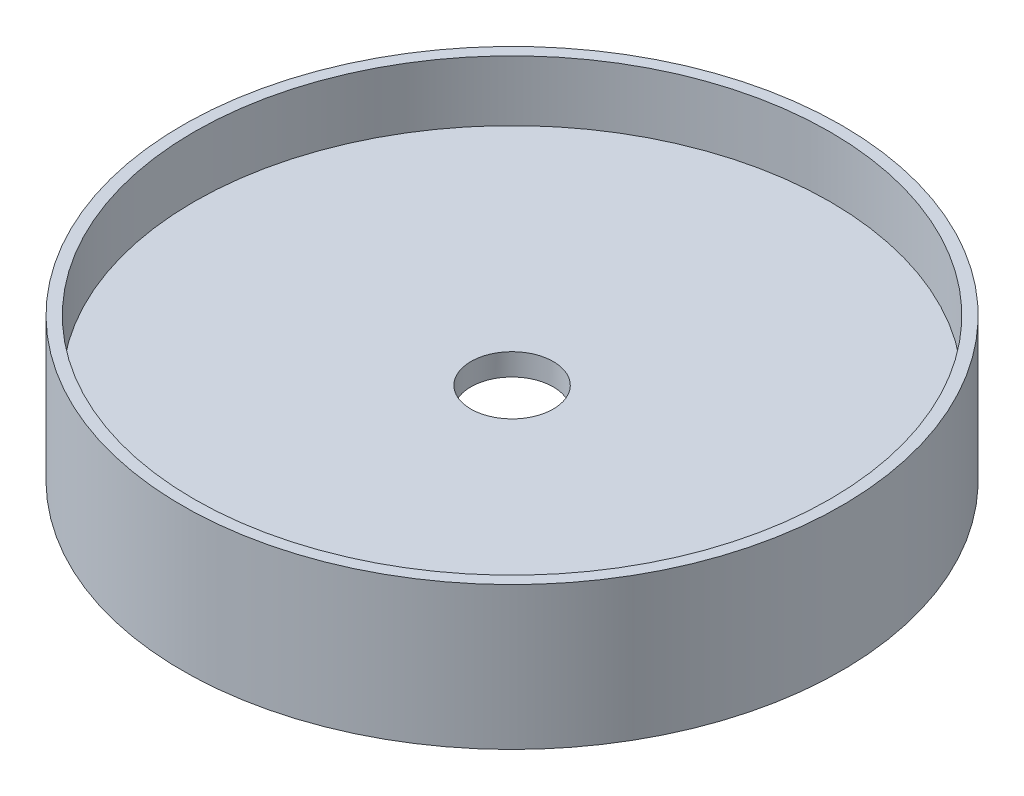
ISO-10303-21;
HEADER;
FILE_DESCRIPTION(('STEP AP214'),'2;1');
FILE_NAME('part.step','',(''),(''),'','','');
FILE_SCHEMA(('AUTOMOTIVE_DESIGN { 1 0 10303 214 1 1 1 1 }'));
ENDSEC;
DATA;
#1=APPLICATION_CONTEXT('core data for automotive mechanical design processes');
#2=APPLICATION_PROTOCOL_DEFINITION('international standard','automotive_design',2000,#1);
#3=PRODUCT_CONTEXT('',#1,'mechanical');
#4=PRODUCT('Part','Part','',(#3));
#5=PRODUCT_RELATED_PRODUCT_CATEGORY('part','',(#4));
#6=PRODUCT_DEFINITION_FORMATION('','',#4);
#7=PRODUCT_DEFINITION_CONTEXT('part definition',#1,'design');
#8=PRODUCT_DEFINITION('design','',#6,#7);
#9=PRODUCT_DEFINITION_SHAPE('','',#8);
#10=(LENGTH_UNIT() NAMED_UNIT(*) SI_UNIT(.MILLI.,.METRE.));
#11=(NAMED_UNIT(*) PLANE_ANGLE_UNIT() SI_UNIT($,.RADIAN.));
#12=(NAMED_UNIT(*) SI_UNIT($,.STERADIAN.) SOLID_ANGLE_UNIT());
#13=UNCERTAINTY_MEASURE_WITH_UNIT(LENGTH_MEASURE(1.E-05),#10,'distance_accuracy_value','');
#14=(GEOMETRIC_REPRESENTATION_CONTEXT(3) GLOBAL_UNCERTAINTY_ASSIGNED_CONTEXT((#13)) GLOBAL_UNIT_ASSIGNED_CONTEXT((#10,
#11,#12)) REPRESENTATION_CONTEXT('',''));
#15=CARTESIAN_POINT('',(0.,0.,0.));
#16=DIRECTION('',(0.,0.,1.));
#17=DIRECTION('',(1.,0.,0.));
#18=AXIS2_PLACEMENT_3D('',#15,#16,#17);
#19=CARTESIAN_POINT('',(0.,20.,0.));
#20=DIRECTION('',(0.,-1.,0.));
#21=DIRECTION('',(0.,0.,-1.));
#22=AXIS2_PLACEMENT_3D('',#19,#20,#21);
#23=PLANE('',#22);
#24=CARTESIAN_POINT('',(0.,20.,0.));
#25=DIRECTION('',(0.,1.,0.));
#26=DIRECTION('',(0.,0.,1.));
#27=AXIS2_PLACEMENT_3D('',#24,#25,#26);
#28=CIRCLE('',#27,37.5);
#29=CARTESIAN_POINT('',(0.,20.,37.5));
#30=VERTEX_POINT('',#29);
#31=EDGE_CURVE('E56',#30,#30,#28,.T.);
#32=ORIENTED_EDGE('',*,*,#31,.F.);
#33=EDGE_LOOP('',(#32));
#34=FACE_BOUND('',#33,.T.);
#35=CARTESIAN_POINT('',(0.,20.,0.));
#36=DIRECTION('',(0.,-1.,0.));
#37=DIRECTION('',(0.,0.,-1.));
#38=AXIS2_PLACEMENT_3D('',#35,#36,#37);
#39=CIRCLE('',#38,289.5);
#40=CARTESIAN_POINT('',(0.,20.,-289.5));
#41=VERTEX_POINT('',#40);
#42=EDGE_CURVE('E10',#41,#41,#39,.T.);
#43=ORIENTED_EDGE('',*,*,#42,.F.);
#44=EDGE_LOOP('',(#43));
#45=FACE_BOUND('',#44,.T.);
#46=ADVANCED_FACE('F31',(#34,#45),#23,.F.);
#47=CARTESIAN_POINT('',(0.,0.,0.));
#48=DIRECTION('',(0.,-1.,0.));
#49=DIRECTION('',(0.,0.,-1.));
#50=AXIS2_PLACEMENT_3D('',#47,#48,#49);
#51=CYLINDRICAL_SURFACE('',#50,289.5);
#52=CARTESIAN_POINT('',(0.,75.,0.));
#53=DIRECTION('',(0.,-1.,0.));
#54=DIRECTION('',(0.,0.,-1.));
#55=AXIS2_PLACEMENT_3D('',#52,#53,#54);
#56=CIRCLE('',#55,289.5);
#57=CARTESIAN_POINT('',(0.,75.,-289.5));
#58=VERTEX_POINT('',#57);
#59=EDGE_CURVE('E38',#58,#58,#56,.T.);
#60=ORIENTED_EDGE('',*,*,#59,.F.);
#61=EDGE_LOOP('',(#60));
#62=FACE_BOUND('',#61,.T.);
#63=ORIENTED_EDGE('',*,*,#42,.T.);
#64=EDGE_LOOP('',(#63));
#65=FACE_BOUND('',#64,.T.);
#66=ADVANCED_FACE('F89',(#62,#65),#51,.F.);
#67=CARTESIAN_POINT('',(289.5,75.,0.));
#68=DIRECTION('',(0.,-1.,0.));
#69=DIRECTION('',(0.,0.,-1.));
#70=AXIS2_PLACEMENT_3D('',#67,#68,#69);
#71=PLANE('',#70);
#72=CARTESIAN_POINT('',(0.,75.,0.));
#73=DIRECTION('',(0.,-1.,0.));
#74=DIRECTION('',(0.,0.,-1.));
#75=AXIS2_PLACEMENT_3D('',#72,#73,#74);
#76=CIRCLE('',#75,300.);
#77=CARTESIAN_POINT('',(0.,75.,-300.));
#78=VERTEX_POINT('',#77);
#79=EDGE_CURVE('E42',#78,#78,#76,.T.);
#80=ORIENTED_EDGE('',*,*,#79,.F.);
#81=EDGE_LOOP('',(#80));
#82=FACE_BOUND('',#81,.T.);
#83=ORIENTED_EDGE('',*,*,#59,.T.);
#84=EDGE_LOOP('',(#83));
#85=FACE_BOUND('',#84,.T.);
#86=ADVANCED_FACE('F85',(#82,#85),#71,.F.);
#87=CARTESIAN_POINT('',(0.,0.,0.));
#88=DIRECTION('',(0.,-1.,0.));
#89=DIRECTION('',(0.,0.,-1.));
#90=AXIS2_PLACEMENT_3D('',#87,#88,#89);
#91=CYLINDRICAL_SURFACE('',#90,300.);
#92=ORIENTED_EDGE('',*,*,#79,.T.);
#93=EDGE_LOOP('',(#92));
#94=FACE_BOUND('',#93,.T.);
#95=CARTESIAN_POINT('',(0.,-55.,0.));
#96=DIRECTION('',(0.,-1.,0.));
#97=DIRECTION('',(0.,0.,-1.));
#98=AXIS2_PLACEMENT_3D('',#95,#96,#97);
#99=CIRCLE('',#98,300.);
#100=CARTESIAN_POINT('',(0.,-55.,-300.));
#101=VERTEX_POINT('',#100);
#102=EDGE_CURVE('E47',#101,#101,#99,.T.);
#103=ORIENTED_EDGE('',*,*,#102,.F.);
#104=EDGE_LOOP('',(#103));
#105=FACE_BOUND('',#104,.T.);
#106=ADVANCED_FACE('F79',(#94,#105),#91,.T.);
#107=CARTESIAN_POINT('',(289.5,-55.,0.));
#108=DIRECTION('',(0.,-1.,0.));
#109=DIRECTION('',(0.,0.,-1.));
#110=AXIS2_PLACEMENT_3D('',#107,#108,#109);
#111=PLANE('',#110);
#112=ORIENTED_EDGE('',*,*,#102,.T.);
#113=EDGE_LOOP('',(#112));
#114=FACE_BOUND('',#113,.T.);
#115=CARTESIAN_POINT('',(0.,-55.,0.));
#116=DIRECTION('',(0.,-1.,0.));
#117=DIRECTION('',(0.,0.,-1.));
#118=AXIS2_PLACEMENT_3D('',#115,#116,#117);
#119=CIRCLE('',#118,289.5);
#120=CARTESIAN_POINT('',(0.,-55.,-289.5));
#121=VERTEX_POINT('',#120);
#122=EDGE_CURVE('E50',#121,#121,#119,.T.);
#123=ORIENTED_EDGE('',*,*,#122,.F.);
#124=EDGE_LOOP('',(#123));
#125=FACE_BOUND('',#124,.T.);
#126=ADVANCED_FACE('F74',(#114,#125),#111,.T.);
#127=CARTESIAN_POINT('',(0.,0.,0.));
#128=DIRECTION('',(0.,-1.,0.));
#129=DIRECTION('',(0.,0.,-1.));
#130=AXIS2_PLACEMENT_3D('',#127,#128,#129);
#131=CYLINDRICAL_SURFACE('',#130,289.5);
#132=CARTESIAN_POINT('',(0.,0.,0.));
#133=DIRECTION('',(0.,-1.,0.));
#134=DIRECTION('',(0.,0.,-1.));
#135=AXIS2_PLACEMENT_3D('',#132,#133,#134);
#136=CIRCLE('',#135,289.5);
#137=CARTESIAN_POINT('',(0.,0.,-289.5));
#138=VERTEX_POINT('',#137);
#139=EDGE_CURVE('E53',#138,#138,#136,.T.);
#140=ORIENTED_EDGE('',*,*,#139,.F.);
#141=EDGE_LOOP('',(#140));
#142=FACE_BOUND('',#141,.T.);
#143=ORIENTED_EDGE('',*,*,#122,.T.);
#144=EDGE_LOOP('',(#143));
#145=FACE_BOUND('',#144,.T.);
#146=ADVANCED_FACE('F68',(#142,#145),#131,.F.);
#147=CARTESIAN_POINT('',(0.,0.,0.));
#148=DIRECTION('',(0.,-1.,0.));
#149=DIRECTION('',(0.,0.,-1.));
#150=AXIS2_PLACEMENT_3D('',#147,#148,#149);
#151=PLANE('',#150);
#152=CARTESIAN_POINT('',(0.,0.,0.));
#153=DIRECTION('',(0.,-1.,0.));
#154=DIRECTION('',(0.,0.,-1.));
#155=AXIS2_PLACEMENT_3D('',#152,#153,#154);
#156=CIRCLE('',#155,37.5);
#157=CARTESIAN_POINT('',(0.,0.,-37.5));
#158=VERTEX_POINT('',#157);
#159=EDGE_CURVE('E34',#158,#158,#156,.T.);
#160=ORIENTED_EDGE('',*,*,#159,.F.);
#161=EDGE_LOOP('',(#160));
#162=FACE_BOUND('',#161,.T.);
#163=ORIENTED_EDGE('',*,*,#139,.T.);
#164=EDGE_LOOP('',(#163));
#165=FACE_BOUND('',#164,.T.);
#166=ADVANCED_FACE('F65',(#162,#165),#151,.T.);
#167=CARTESIAN_POINT('',(0.,-55.,0.));
#168=DIRECTION('',(0.,1.,0.));
#169=DIRECTION('',(0.,0.,1.));
#170=AXIS2_PLACEMENT_3D('',#167,#168,#169);
#171=CYLINDRICAL_SURFACE('',#170,37.5);
#172=ORIENTED_EDGE('',*,*,#159,.T.);
#173=EDGE_LOOP('',(#172));
#174=FACE_BOUND('',#173,.T.);
#175=ORIENTED_EDGE('',*,*,#31,.T.);
#176=EDGE_LOOP('',(#175));
#177=FACE_BOUND('',#176,.T.);
#178=ADVANCED_FACE('F63',(#174,#177),#171,.F.);
#179=CLOSED_SHELL('',(#46,#66,#86,#106,#126,#146,#166,#178));
#180=MANIFOLD_SOLID_BREP('B2',#179);
#181=ADVANCED_BREP_SHAPE_REPRESENTATION('',(#18,#180),#14);
#182=SHAPE_DEFINITION_REPRESENTATION(#9,#181);
ENDSEC;
END-ISO-10303-21;
